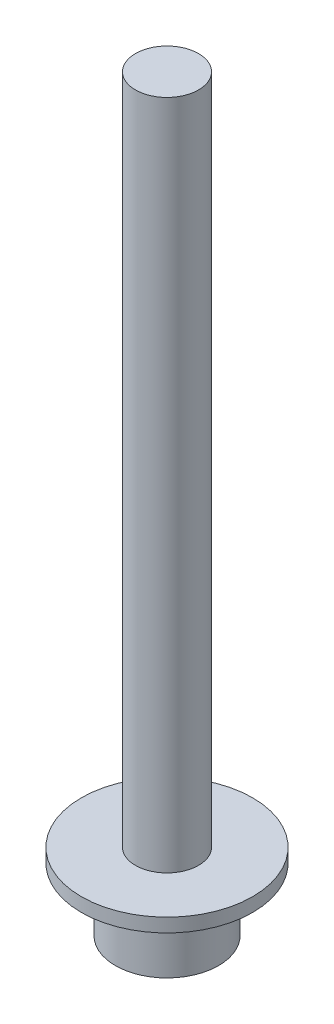
ISO-10303-21;
HEADER;
FILE_DESCRIPTION(('STEP AP214'),'2;1');
FILE_NAME('part.step','',(''),(''),'','','');
FILE_SCHEMA(('AUTOMOTIVE_DESIGN { 1 0 10303 214 1 1 1 1 }'));
ENDSEC;
DATA;
#1=APPLICATION_CONTEXT('core data for automotive mechanical design processes');
#2=APPLICATION_PROTOCOL_DEFINITION('international standard','automotive_design',2000,#1);
#3=PRODUCT_CONTEXT('',#1,'mechanical');
#4=PRODUCT('Part','Part','',(#3));
#5=PRODUCT_RELATED_PRODUCT_CATEGORY('part','',(#4));
#6=PRODUCT_DEFINITION_FORMATION('','',#4);
#7=PRODUCT_DEFINITION_CONTEXT('part definition',#1,'design');
#8=PRODUCT_DEFINITION('design','',#6,#7);
#9=PRODUCT_DEFINITION_SHAPE('','',#8);
#10=(LENGTH_UNIT() NAMED_UNIT(*) SI_UNIT(.MILLI.,.METRE.));
#11=(NAMED_UNIT(*) PLANE_ANGLE_UNIT() SI_UNIT($,.RADIAN.));
#12=(NAMED_UNIT(*) SI_UNIT($,.STERADIAN.) SOLID_ANGLE_UNIT());
#13=UNCERTAINTY_MEASURE_WITH_UNIT(LENGTH_MEASURE(1.E-05),#10,'distance_accuracy_value','');
#14=(GEOMETRIC_REPRESENTATION_CONTEXT(3) GLOBAL_UNCERTAINTY_ASSIGNED_CONTEXT((#13)) GLOBAL_UNIT_ASSIGNED_CONTEXT((#10,
#11,#12)) REPRESENTATION_CONTEXT('',''));
#15=CARTESIAN_POINT('',(0.,0.,0.));
#16=DIRECTION('',(0.,0.,1.));
#17=DIRECTION('',(1.,0.,0.));
#18=AXIS2_PLACEMENT_3D('',#15,#16,#17);
#19=CARTESIAN_POINT('',(-24.4127398922432,-38.8854051601428,-3.43304154734662));
#20=DIRECTION('',(0.,-1.,0.));
#21=DIRECTION('',(0.,0.,-1.));
#22=AXIS2_PLACEMENT_3D('',#19,#20,#21);
#23=PLANE('',#22);
#24=CARTESIAN_POINT('',(-22.9699187043962,-38.8854051601428,-13.6931033275923));
#25=DIRECTION('',(0.,-1.,0.));
#26=DIRECTION('',(0.,0.,-1.));
#27=AXIS2_PLACEMENT_3D('',#24,#25,#26);
#28=CIRCLE('',#27,4.76250000000004);
#29=CARTESIAN_POINT('',(-22.9699187043962,-38.8854051601428,-18.4556033275924));
#30=VERTEX_POINT('',#29);
#31=EDGE_CURVE('E54',#30,#30,#28,.T.);
#32=ORIENTED_EDGE('',*,*,#31,.T.);
#33=EDGE_LOOP('',(#32));
#34=FACE_BOUND('',#33,.T.);
#35=CARTESIAN_POINT('',(-22.9699187043962,-38.8854051601428,-13.6931033275923));
#36=DIRECTION('',(0.,-1.,0.));
#37=DIRECTION('',(0.,0.,-1.));
#38=AXIS2_PLACEMENT_3D('',#35,#36,#37);
#39=CIRCLE('',#38,2.87020000000004);
#40=CARTESIAN_POINT('',(-22.9699187043962,-38.8854051601428,-16.5633033275924));
#41=VERTEX_POINT('',#40);
#42=EDGE_CURVE('E10',#41,#41,#39,.T.);
#43=ORIENTED_EDGE('',*,*,#42,.F.);
#44=EDGE_LOOP('',(#43));
#45=FACE_BOUND('',#44,.T.);
#46=ADVANCED_FACE('F32',(#34,#45),#23,.T.);
#47=CARTESIAN_POINT('',(-22.9699187043962,-42.3906051601428,-13.6931033275923));
#48=DIRECTION('',(0.,-1.,0.));
#49=DIRECTION('',(0.,0.,-1.));
#50=AXIS2_PLACEMENT_3D('',#47,#48,#49);
#51=CYLINDRICAL_SURFACE('',#50,2.87020000000002);
#52=CARTESIAN_POINT('',(-22.9699187043962,-42.3906051601428,-13.6931033275923));
#53=DIRECTION('',(0.,-1.,0.));
#54=DIRECTION('',(0.,0.,-1.));
#55=AXIS2_PLACEMENT_3D('',#52,#53,#54);
#56=CIRCLE('',#55,2.8702);
#57=CARTESIAN_POINT('',(-22.9699187043962,-42.3906051601428,-16.5633033275923));
#58=VERTEX_POINT('',#57);
#59=EDGE_CURVE('E38',#58,#58,#56,.T.);
#60=ORIENTED_EDGE('',*,*,#59,.F.);
#61=EDGE_LOOP('',(#60));
#62=FACE_BOUND('',#61,.T.);
#63=ORIENTED_EDGE('',*,*,#42,.T.);
#64=EDGE_LOOP('',(#63));
#65=FACE_BOUND('',#64,.T.);
#66=ADVANCED_FACE('F72',(#62,#65),#51,.T.);
#67=CARTESIAN_POINT('',(-24.4127398922432,-42.3906051601428,-3.43304154734662));
#68=DIRECTION('',(0.,-1.,0.));
#69=DIRECTION('',(0.,0.,-1.));
#70=AXIS2_PLACEMENT_3D('',#67,#68,#69);
#71=PLANE('',#70);
#72=ORIENTED_EDGE('',*,*,#59,.T.);
#73=EDGE_LOOP('',(#72));
#74=FACE_BOUND('',#73,.T.);
#75=ADVANCED_FACE('F76',(#74),#71,.T.);
#76=CARTESIAN_POINT('',(-24.4127398922432,-0.785405160142805,-3.43304154734662));
#77=DIRECTION('',(0.,-1.,0.));
#78=DIRECTION('',(0.,0.,-1.));
#79=AXIS2_PLACEMENT_3D('',#76,#77,#78);
#80=PLANE('',#79);
#81=CARTESIAN_POINT('',(-22.9699187043962,-0.785405160142805,-13.6931033275923));
#82=DIRECTION('',(0.,-1.,0.));
#83=DIRECTION('',(0.,0.,-1.));
#84=AXIS2_PLACEMENT_3D('',#81,#82,#83);
#85=CIRCLE('',#84,1.75259999999998);
#86=CARTESIAN_POINT('',(-22.9699187043962,-0.785405160142805,-15.4457033275923));
#87=VERTEX_POINT('',#86);
#88=EDGE_CURVE('E42',#87,#87,#85,.T.);
#89=ORIENTED_EDGE('',*,*,#88,.F.);
#90=EDGE_LOOP('',(#89));
#91=FACE_BOUND('',#90,.T.);
#92=ADVANCED_FACE('F81',(#91),#80,.F.);
#93=CARTESIAN_POINT('',(-22.9699187043962,-42.3906051601428,-13.6931033275923));
#94=DIRECTION('',(0.,-1.,0.));
#95=DIRECTION('',(0.,0.,-1.));
#96=AXIS2_PLACEMENT_3D('',#93,#94,#95);
#97=CYLINDRICAL_SURFACE('',#96,1.75259999999998);
#98=ORIENTED_EDGE('',*,*,#88,.T.);
#99=EDGE_LOOP('',(#98));
#100=FACE_BOUND('',#99,.T.);
#101=CARTESIAN_POINT('',(-22.9699187043962,-38.1234051601428,-13.6931033275923));
#102=DIRECTION('',(0.,-1.,0.));
#103=DIRECTION('',(0.,0.,-1.));
#104=AXIS2_PLACEMENT_3D('',#101,#102,#103);
#105=CIRCLE('',#104,1.75259999999998);
#106=CARTESIAN_POINT('',(-22.9699187043962,-38.1234051601428,-15.4457033275923));
#107=VERTEX_POINT('',#106);
#108=EDGE_CURVE('E46',#107,#107,#105,.T.);
#109=ORIENTED_EDGE('',*,*,#108,.F.);
#110=EDGE_LOOP('',(#109));
#111=FACE_BOUND('',#110,.T.);
#112=ADVANCED_FACE('F68',(#100,#111),#97,.T.);
#113=CARTESIAN_POINT('',(-24.4127398922432,-38.1234051601428,-3.43304154734662));
#114=DIRECTION('',(0.,-1.,0.));
#115=DIRECTION('',(0.,0.,-1.));
#116=AXIS2_PLACEMENT_3D('',#113,#114,#115);
#117=PLANE('',#116);
#118=CARTESIAN_POINT('',(-22.9699187043962,-38.1234051601428,-13.6931033275923));
#119=DIRECTION('',(0.,-1.,0.));
#120=DIRECTION('',(0.,0.,-1.));
#121=AXIS2_PLACEMENT_3D('',#118,#119,#120);
#122=CIRCLE('',#121,4.7625);
#123=CARTESIAN_POINT('',(-22.9699187043962,-38.1234051601428,-18.4556033275923));
#124=VERTEX_POINT('',#123);
#125=EDGE_CURVE('E51',#124,#124,#122,.T.);
#126=ORIENTED_EDGE('',*,*,#125,.F.);
#127=EDGE_LOOP('',(#126));
#128=FACE_BOUND('',#127,.T.);
#129=ORIENTED_EDGE('',*,*,#108,.T.);
#130=EDGE_LOOP('',(#129));
#131=FACE_BOUND('',#130,.T.);
#132=ADVANCED_FACE('F62',(#128,#131),#117,.F.);
#133=CARTESIAN_POINT('',(-22.9699187043962,-42.3906051601428,-13.6931033275923));
#134=DIRECTION('',(0.,-1.,0.));
#135=DIRECTION('',(0.,0.,-1.));
#136=AXIS2_PLACEMENT_3D('',#133,#134,#135);
#137=CYLINDRICAL_SURFACE('',#136,4.76250000000002);
#138=ORIENTED_EDGE('',*,*,#125,.T.);
#139=EDGE_LOOP('',(#138));
#140=FACE_BOUND('',#139,.T.);
#141=ORIENTED_EDGE('',*,*,#31,.F.);
#142=EDGE_LOOP('',(#141));
#143=FACE_BOUND('',#142,.T.);
#144=ADVANCED_FACE('F60',(#140,#143),#137,.T.);
#145=CLOSED_SHELL('',(#46,#66,#75,#92,#112,#132,#144));
#146=MANIFOLD_SOLID_BREP('B2',#145);
#147=ADVANCED_BREP_SHAPE_REPRESENTATION('',(#18,#146),#14);
#148=SHAPE_DEFINITION_REPRESENTATION(#9,#147);
ENDSEC;
END-ISO-10303-21;
